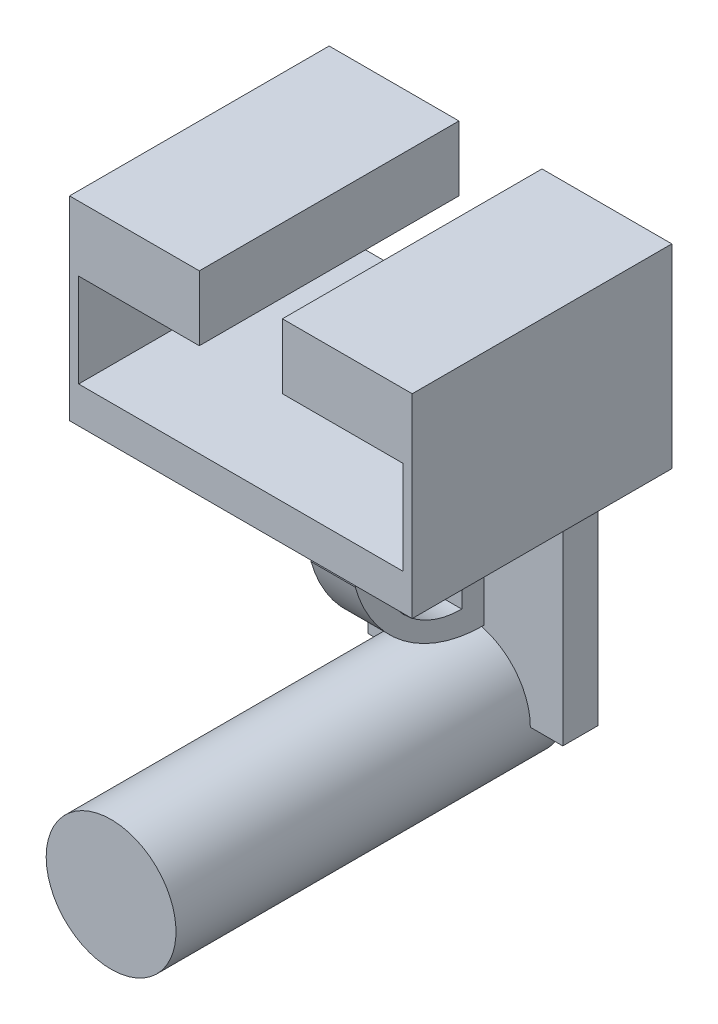
ISO-10303-21;
HEADER;
FILE_DESCRIPTION(('STEP AP214'),'2;1');
FILE_NAME('part.step','',(''),(''),'','','');
FILE_SCHEMA(('AUTOMOTIVE_DESIGN { 1 0 10303 214 1 1 1 1 }'));
ENDSEC;
DATA;
#1=APPLICATION_CONTEXT('core data for automotive mechanical design processes');
#2=APPLICATION_PROTOCOL_DEFINITION('international standard','automotive_design',2000,#1);
#3=PRODUCT_CONTEXT('',#1,'mechanical');
#4=PRODUCT('Part','Part','',(#3));
#5=PRODUCT_RELATED_PRODUCT_CATEGORY('part','',(#4));
#6=PRODUCT_DEFINITION_FORMATION('','',#4);
#7=PRODUCT_DEFINITION_CONTEXT('part definition',#1,'design');
#8=PRODUCT_DEFINITION('design','',#6,#7);
#9=PRODUCT_DEFINITION_SHAPE('','',#8);
#10=(LENGTH_UNIT() NAMED_UNIT(*) SI_UNIT(.MILLI.,.METRE.));
#11=(NAMED_UNIT(*) PLANE_ANGLE_UNIT() SI_UNIT($,.RADIAN.));
#12=(NAMED_UNIT(*) SI_UNIT($,.STERADIAN.) SOLID_ANGLE_UNIT());
#13=UNCERTAINTY_MEASURE_WITH_UNIT(LENGTH_MEASURE(1.E-05),#10,'distance_accuracy_value','');
#14=(GEOMETRIC_REPRESENTATION_CONTEXT(3) GLOBAL_UNCERTAINTY_ASSIGNED_CONTEXT((#13)) GLOBAL_UNIT_ASSIGNED_CONTEXT((#10,
#11,#12)) REPRESENTATION_CONTEXT('',''));
#15=CARTESIAN_POINT('',(0.,0.,0.));
#16=DIRECTION('',(0.,0.,1.));
#17=DIRECTION('',(1.,0.,0.));
#18=AXIS2_PLACEMENT_3D('',#15,#16,#17);
#19=CARTESIAN_POINT('',(22.6356753232579,12.7,32.004));
#20=DIRECTION('',(-1.,0.,0.));
#21=DIRECTION('',(0.,0.,1.));
#22=AXIS2_PLACEMENT_3D('',#19,#20,#21);
#23=PLANE('',#22);
#24=DIRECTION('',(0.,1.,0.));
#25=VECTOR('',#24,1.);
#26=CARTESIAN_POINT('',(22.6356753232579,47.1850733138113,27.0726006673739));
#27=LINE('',#26,#25);
#28=CARTESIAN_POINT('',(22.6356753232579,32.3983332996082,27.0726006673739));
#29=VERTEX_POINT('',#28);
#30=CARTESIAN_POINT('',(22.6356753232579,47.1850733138113,27.0726006673739));
#31=VERTEX_POINT('',#30);
#32=EDGE_CURVE('E140',#29,#31,#27,.T.);
#33=ORIENTED_EDGE('',*,*,#32,.T.);
#34=DIRECTION('',(0.,0.,-1.));
#35=VECTOR('',#34,1.);
#36=CARTESIAN_POINT('',(22.6356753232579,47.1850733138113,11.1580584486977));
#37=LINE('',#36,#35);
#38=CARTESIAN_POINT('',(22.6356753232579,47.1850733138113,11.1580584486977));
#39=VERTEX_POINT('',#38);
#40=EDGE_CURVE('E134',#31,#39,#37,.T.);
#41=ORIENTED_EDGE('',*,*,#40,.T.);
#42=DIRECTION('',(0.,-1.,0.));
#43=VECTOR('',#42,1.);
#44=CARTESIAN_POINT('',(22.6356753232579,47.1850733138113,11.1580584486977));
#45=LINE('',#44,#43);
#46=CARTESIAN_POINT('',(22.6356753232579,17.611593285405,11.1580584486977));
#47=VERTEX_POINT('',#46);
#48=EDGE_CURVE('E142',#39,#47,#45,.T.);
#49=ORIENTED_EDGE('',*,*,#48,.T.);
#50=CARTESIAN_POINT('',(22.6356753232579,33.5691449101841,11.1580584486977));
#51=DIRECTION('',(-1.,0.,0.));
#52=DIRECTION('',(0.,-1.,0.));
#53=AXIS2_PLACEMENT_3D('',#50,#51,#52);
#54=CIRCLE('',#53,15.9575516247791);
#55=EDGE_CURVE('E73',#47,#29,#54,.T.);
#56=ORIENTED_EDGE('',*,*,#55,.T.);
#57=EDGE_LOOP('',(#33,#41,#49,#56));
#58=FACE_BOUND('',#57,.T.);
#59=DIRECTION('',(0.,1.,0.));
#60=VECTOR('',#59,1.);
#61=CARTESIAN_POINT('',(22.6356753232579,12.7,32.004));
#62=LINE('',#61,#60);
#63=CARTESIAN_POINT('',(22.6356753232579,31.75,32.004));
#64=VERTEX_POINT('',#63);
#65=CARTESIAN_POINT('',(22.6356753232579,50.8,32.004));
#66=VERTEX_POINT('',#65);
#67=EDGE_CURVE('E177',#64,#66,#62,.T.);
#68=ORIENTED_EDGE('',*,*,#67,.F.);
#69=CARTESIAN_POINT('',(22.6356753232579,38.82136,6.858));
#70=DIRECTION('',(1.,0.,0.));
#71=DIRECTION('',(0.,-1.,0.));
#72=AXIS2_PLACEMENT_3D('',#69,#70,#71);
#73=CIRCLE('',#72,26.12136);
#74=CARTESIAN_POINT('',(22.6356753232579,12.7,6.858));
#75=VERTEX_POINT('',#74);
#76=EDGE_CURVE('E168',#64,#75,#73,.T.);
#77=ORIENTED_EDGE('',*,*,#76,.T.);
#78=DIRECTION('',(0.,0.,-1.));
#79=VECTOR('',#78,1.);
#80=CARTESIAN_POINT('',(22.6356753232579,12.7,32.004));
#81=LINE('',#80,#79);
#82=CARTESIAN_POINT('',(22.6356753232579,12.7,0.));
#83=VERTEX_POINT('',#82);
#84=EDGE_CURVE('E67',#75,#83,#81,.T.);
#85=ORIENTED_EDGE('',*,*,#84,.T.);
#86=DIRECTION('',(0.,1.,0.));
#87=VECTOR('',#86,1.);
#88=CARTESIAN_POINT('',(22.6356753232579,12.7,0.));
#89=LINE('',#88,#87);
#90=CARTESIAN_POINT('',(22.6356753232579,50.8,0.));
#91=VERTEX_POINT('',#90);
#92=EDGE_CURVE('E188',#83,#91,#89,.T.);
#93=ORIENTED_EDGE('',*,*,#92,.T.);
#94=DIRECTION('',(0.,0.,-1.));
#95=VECTOR('',#94,1.);
#96=CARTESIAN_POINT('',(22.6356753232579,50.8,32.004));
#97=LINE('',#96,#95);
#98=EDGE_CURVE('E193',#66,#91,#97,.T.);
#99=ORIENTED_EDGE('',*,*,#98,.F.);
#100=EDGE_LOOP('',(#68,#77,#85,#93,#99));
#101=FACE_BOUND('',#100,.T.);
#102=ADVANCED_FACE('F58',(#58,#101),#23,.F.);
#103=CARTESIAN_POINT('',(13.9824883681285,50.8,32.004));
#104=DIRECTION('',(1.,0.,0.));
#105=DIRECTION('',(0.,1.,0.));
#106=AXIS2_PLACEMENT_3D('',#103,#104,#105);
#107=PLANE('',#106);
#108=DIRECTION('',(0.,-1.,0.));
#109=VECTOR('',#108,1.);
#110=CARTESIAN_POINT('',(13.9824883681285,47.1850733138113,11.1580584486977));
#111=LINE('',#110,#109);
#112=CARTESIAN_POINT('',(13.9824883681285,47.1850733138113,11.1580584486977));
#113=VERTEX_POINT('',#112);
#114=CARTESIAN_POINT('',(13.9824883681285,17.611593285405,11.1580584486977));
#115=VERTEX_POINT('',#114);
#116=EDGE_CURVE('E157',#113,#115,#111,.T.);
#117=ORIENTED_EDGE('',*,*,#116,.F.);
#118=DIRECTION('',(0.,0.,-1.));
#119=VECTOR('',#118,1.);
#120=CARTESIAN_POINT('',(13.9824883681285,47.1850733138113,11.1580584486977));
#121=LINE('',#120,#119);
#122=CARTESIAN_POINT('',(13.9824883681285,47.1850733138113,27.0726006673739));
#123=VERTEX_POINT('',#122);
#124=EDGE_CURVE('E84',#123,#113,#121,.T.);
#125=ORIENTED_EDGE('',*,*,#124,.F.);
#126=DIRECTION('',(0.,1.,0.));
#127=VECTOR('',#126,1.);
#128=CARTESIAN_POINT('',(13.9824883681285,47.1850733138113,27.0726006673739));
#129=LINE('',#128,#127);
#130=CARTESIAN_POINT('',(13.9824883681285,32.3983332996082,27.0726006673739));
#131=VERTEX_POINT('',#130);
#132=EDGE_CURVE('E150',#131,#123,#129,.T.);
#133=ORIENTED_EDGE('',*,*,#132,.F.);
#134=CARTESIAN_POINT('',(13.9824883681285,33.5691449101841,11.1580584486977));
#135=DIRECTION('',(-1.,0.,0.));
#136=DIRECTION('',(0.,-1.,0.));
#137=AXIS2_PLACEMENT_3D('',#134,#135,#136);
#138=CIRCLE('',#137,15.9575516247791);
#139=EDGE_CURVE('E148',#115,#131,#138,.T.);
#140=ORIENTED_EDGE('',*,*,#139,.F.);
#141=EDGE_LOOP('',(#117,#125,#133,#140));
#142=FACE_BOUND('',#141,.T.);
#143=CARTESIAN_POINT('',(13.9824883681285,38.82136,6.858));
#144=DIRECTION('',(1.,0.,0.));
#145=DIRECTION('',(0.,-1.,0.));
#146=AXIS2_PLACEMENT_3D('',#143,#144,#145);
#147=CIRCLE('',#146,26.12136);
#148=CARTESIAN_POINT('',(13.9824883681285,31.75,32.004));
#149=VERTEX_POINT('',#148);
#150=CARTESIAN_POINT('',(13.9824883681285,12.7,6.858));
#151=VERTEX_POINT('',#150);
#152=EDGE_CURVE('E162',#149,#151,#147,.T.);
#153=ORIENTED_EDGE('',*,*,#152,.F.);
#154=DIRECTION('',(0.,-1.,0.));
#155=VECTOR('',#154,1.);
#156=CARTESIAN_POINT('',(13.9824883681285,50.8,32.004));
#157=LINE('',#156,#155);
#158=CARTESIAN_POINT('',(13.9824883681285,50.8,32.004));
#159=VERTEX_POINT('',#158);
#160=EDGE_CURVE('E176',#159,#149,#157,.T.);
#161=ORIENTED_EDGE('',*,*,#160,.F.);
#162=DIRECTION('',(0.,0.,-1.));
#163=VECTOR('',#162,1.);
#164=CARTESIAN_POINT('',(13.9824883681285,50.8,32.004));
#165=LINE('',#164,#163);
#166=CARTESIAN_POINT('',(13.9824883681285,50.8,0.));
#167=VERTEX_POINT('',#166);
#168=EDGE_CURVE('E183',#159,#167,#165,.T.);
#169=ORIENTED_EDGE('',*,*,#168,.T.);
#170=DIRECTION('',(0.,-1.,0.));
#171=VECTOR('',#170,1.);
#172=CARTESIAN_POINT('',(13.9824883681285,50.8,0.));
#173=LINE('',#172,#171);
#174=CARTESIAN_POINT('',(13.9824883681285,12.7,0.));
#175=VERTEX_POINT('',#174);
#176=EDGE_CURVE('E173',#167,#175,#173,.T.);
#177=ORIENTED_EDGE('',*,*,#176,.T.);
#178=DIRECTION('',(0.,0.,-1.));
#179=VECTOR('',#178,1.);
#180=CARTESIAN_POINT('',(13.9824883681285,12.7,32.004));
#181=LINE('',#180,#179);
#182=EDGE_CURVE('E12',#151,#175,#181,.T.);
#183=ORIENTED_EDGE('',*,*,#182,.F.);
#184=EDGE_LOOP('',(#153,#161,#169,#177,#183));
#185=FACE_BOUND('',#184,.T.);
#186=ADVANCED_FACE('F65',(#142,#185),#107,.F.);
#187=CARTESIAN_POINT('',(13.9824883681285,12.7,32.004));
#188=DIRECTION('',(0.,1.,0.));
#189=DIRECTION('',(0.,0.,1.));
#190=AXIS2_PLACEMENT_3D('',#187,#188,#189);
#191=PLANE('',#190);
#192=ORIENTED_EDGE('',*,*,#84,.F.);
#193=DIRECTION('',(-1.,0.,0.));
#194=VECTOR('',#193,1.);
#195=CARTESIAN_POINT('',(22.6356753232579,12.7,6.858));
#196=LINE('',#195,#194);
#197=EDGE_CURVE('E169',#75,#151,#196,.T.);
#198=ORIENTED_EDGE('',*,*,#197,.T.);
#199=ORIENTED_EDGE('',*,*,#182,.T.);
#200=DIRECTION('',(1.,0.,0.));
#201=VECTOR('',#200,1.);
#202=CARTESIAN_POINT('',(13.9824883681285,12.7,0.));
#203=LINE('',#202,#201);
#204=EDGE_CURVE('E190',#175,#83,#203,.T.);
#205=ORIENTED_EDGE('',*,*,#204,.T.);
#206=EDGE_LOOP('',(#192,#198,#199,#205));
#207=FACE_BOUND('',#206,.T.);
#208=ADVANCED_FACE('F205',(#207),#191,.F.);
#209=CARTESIAN_POINT('',(22.6356753232579,50.8,32.004));
#210=DIRECTION('',(0.,-1.,0.));
#211=DIRECTION('',(0.,0.,-1.));
#212=AXIS2_PLACEMENT_3D('',#209,#210,#211);
#213=PLANE('',#212);
#214=DIRECTION('',(-1.,0.,0.));
#215=VECTOR('',#214,1.);
#216=CARTESIAN_POINT('',(22.6356753232579,50.8,0.));
#217=LINE('',#216,#215);
#218=EDGE_CURVE('E179',#91,#167,#217,.T.);
#219=ORIENTED_EDGE('',*,*,#218,.T.);
#220=ORIENTED_EDGE('',*,*,#168,.F.);
#221=DIRECTION('',(-1.,0.,0.));
#222=VECTOR('',#221,1.);
#223=CARTESIAN_POINT('',(22.6356753232579,50.8,32.004));
#224=LINE('',#223,#222);
#225=EDGE_CURVE('E185',#66,#159,#224,.T.);
#226=ORIENTED_EDGE('',*,*,#225,.F.);
#227=ORIENTED_EDGE('',*,*,#98,.T.);
#228=EDGE_LOOP('',(#219,#220,#226,#227));
#229=FACE_BOUND('',#228,.T.);
#230=ADVANCED_FACE('F212',(#229),#213,.F.);
#231=CARTESIAN_POINT('',(0.,0.,32.004));
#232=DIRECTION('',(0.,0.,1.));
#233=DIRECTION('',(1.,0.,0.));
#234=AXIS2_PLACEMENT_3D('',#231,#232,#233);
#235=PLANE('',#234);
#236=DIRECTION('',(-1.,0.,0.));
#237=VECTOR('',#236,1.);
#238=CARTESIAN_POINT('',(22.6356753232579,31.75,32.004));
#239=LINE('',#238,#237);
#240=EDGE_CURVE('E171',#64,#149,#239,.T.);
#241=ORIENTED_EDGE('',*,*,#240,.F.);
#242=ORIENTED_EDGE('',*,*,#67,.T.);
#243=ORIENTED_EDGE('',*,*,#225,.T.);
#244=ORIENTED_EDGE('',*,*,#160,.T.);
#245=EDGE_LOOP('',(#241,#242,#243,#244));
#246=FACE_BOUND('',#245,.T.);
#247=ADVANCED_FACE('F217',(#246),#235,.T.);
#248=CARTESIAN_POINT('',(0.,0.,0.));
#249=DIRECTION('',(0.,0.,1.));
#250=DIRECTION('',(1.,0.,0.));
#251=AXIS2_PLACEMENT_3D('',#248,#249,#250);
#252=PLANE('',#251);
#253=ORIENTED_EDGE('',*,*,#176,.F.);
#254=ORIENTED_EDGE('',*,*,#218,.F.);
#255=ORIENTED_EDGE('',*,*,#92,.F.);
#256=ORIENTED_EDGE('',*,*,#204,.F.);
#257=EDGE_LOOP('',(#253,#254,#255,#256));
#258=FACE_BOUND('',#257,.T.);
#259=ADVANCED_FACE('F206',(#258),#252,.F.);
#260=CARTESIAN_POINT('',(22.6356753232579,38.82136,6.858));
#261=DIRECTION('',(-1.,0.,0.));
#262=DIRECTION('',(0.,-1.,0.));
#263=AXIS2_PLACEMENT_3D('',#260,#261,#262);
#264=CYLINDRICAL_SURFACE('',#263,26.12136);
#265=ORIENTED_EDGE('',*,*,#152,.T.);
#266=ORIENTED_EDGE('',*,*,#197,.F.);
#267=ORIENTED_EDGE('',*,*,#76,.F.);
#268=ORIENTED_EDGE('',*,*,#240,.T.);
#269=EDGE_LOOP('',(#265,#266,#267,#268));
#270=FACE_BOUND('',#269,.T.);
#271=ADVANCED_FACE('F216',(#270),#264,.T.);
#272=CARTESIAN_POINT('',(22.6356753232579,47.1850733138113,11.1580584486977));
#273=DIRECTION('',(0.,1.,0.));
#274=DIRECTION('',(-1.,0.,0.));
#275=AXIS2_PLACEMENT_3D('',#272,#273,#274);
#276=PLANE('',#275);
#277=ORIENTED_EDGE('',*,*,#124,.T.);
#278=DIRECTION('',(-1.,0.,0.));
#279=VECTOR('',#278,1.);
#280=CARTESIAN_POINT('',(22.6356753232579,47.1850733138113,11.1580584486977));
#281=LINE('',#280,#279);
#282=EDGE_CURVE('E129',#39,#113,#281,.T.);
#283=ORIENTED_EDGE('',*,*,#282,.F.);
#284=ORIENTED_EDGE('',*,*,#40,.F.);
#285=DIRECTION('',(-1.,0.,0.));
#286=VECTOR('',#285,1.);
#287=CARTESIAN_POINT('',(22.6356753232579,47.1850733138113,27.0726006673739));
#288=LINE('',#287,#286);
#289=EDGE_CURVE('E158',#31,#123,#288,.T.);
#290=ORIENTED_EDGE('',*,*,#289,.T.);
#291=EDGE_LOOP('',(#277,#283,#284,#290));
#292=FACE_BOUND('',#291,.T.);
#293=ADVANCED_FACE('F128',(#292),#276,.F.);
#294=CARTESIAN_POINT('',(22.6356753232579,47.1850733138113,27.0726006673739));
#295=DIRECTION('',(0.,0.,1.));
#296=DIRECTION('',(1.,0.,0.));
#297=AXIS2_PLACEMENT_3D('',#294,#295,#296);
#298=PLANE('',#297);
#299=ORIENTED_EDGE('',*,*,#132,.T.);
#300=ORIENTED_EDGE('',*,*,#289,.F.);
#301=ORIENTED_EDGE('',*,*,#32,.F.);
#302=DIRECTION('',(-1.,0.,0.));
#303=VECTOR('',#302,1.);
#304=CARTESIAN_POINT('',(22.6356753232579,32.3983332996082,27.0726006673739));
#305=LINE('',#304,#303);
#306=EDGE_CURVE('E161',#29,#131,#305,.T.);
#307=ORIENTED_EDGE('',*,*,#306,.T.);
#308=EDGE_LOOP('',(#299,#300,#301,#307));
#309=FACE_BOUND('',#308,.T.);
#310=ADVANCED_FACE('F228',(#309),#298,.F.);
#311=CARTESIAN_POINT('',(22.6356753232579,33.5691449101841,11.1580584486977));
#312=DIRECTION('',(-1.,0.,0.));
#313=DIRECTION('',(0.,-1.,0.));
#314=AXIS2_PLACEMENT_3D('',#311,#312,#313);
#315=CYLINDRICAL_SURFACE('',#314,15.9575516247791);
#316=ORIENTED_EDGE('',*,*,#139,.T.);
#317=ORIENTED_EDGE('',*,*,#306,.F.);
#318=ORIENTED_EDGE('',*,*,#55,.F.);
#319=DIRECTION('',(-1.,0.,0.));
#320=VECTOR('',#319,1.);
#321=CARTESIAN_POINT('',(22.6356753232579,17.611593285405,11.1580584486977));
#322=LINE('',#321,#320);
#323=EDGE_CURVE('E139',#47,#115,#322,.T.);
#324=ORIENTED_EDGE('',*,*,#323,.T.);
#325=EDGE_LOOP('',(#316,#317,#318,#324));
#326=FACE_BOUND('',#325,.T.);
#327=ADVANCED_FACE('F275',(#326),#315,.F.);
#328=CARTESIAN_POINT('',(22.6356753232579,47.1850733138113,11.1580584486977));
#329=DIRECTION('',(0.,0.,-1.));
#330=DIRECTION('',(-1.,0.,0.));
#331=AXIS2_PLACEMENT_3D('',#328,#329,#330);
#332=PLANE('',#331);
#333=ORIENTED_EDGE('',*,*,#116,.T.);
#334=ORIENTED_EDGE('',*,*,#323,.F.);
#335=ORIENTED_EDGE('',*,*,#48,.F.);
#336=ORIENTED_EDGE('',*,*,#282,.T.);
#337=EDGE_LOOP('',(#333,#334,#335,#336));
#338=FACE_BOUND('',#337,.T.);
#339=ADVANCED_FACE('F145',(#338),#332,.F.);
#340=CLOSED_SHELL('',(#102,#186,#208,#230,#247,#259,#271,#293,#310,#327,#339));
#341=MANIFOLD_SOLID_BREP('B2',#340);
#342=CARTESIAN_POINT('',(-12.7,0.,0.));
#343=DIRECTION('',(-1.,0.,0.));
#344=DIRECTION('',(0.,0.,1.));
#345=AXIS2_PLACEMENT_3D('',#342,#343,#344);
#346=PLANE('',#345);
#347=DIRECTION('',(0.,0.,-1.));
#348=VECTOR('',#347,1.);
#349=CARTESIAN_POINT('',(-12.7,76.2,0.));
#350=LINE('',#349,#348);
#351=CARTESIAN_POINT('',(-12.7,76.2,50.8));
#352=VERTEX_POINT('',#351);
#353=CARTESIAN_POINT('',(-12.7,76.2,0.));
#354=VERTEX_POINT('',#353);
#355=EDGE_CURVE('E59',#352,#354,#350,.T.);
#356=ORIENTED_EDGE('',*,*,#355,.F.);
#357=DIRECTION('',(0.,1.,0.));
#358=VECTOR('',#357,1.);
#359=CARTESIAN_POINT('',(-12.7,88.9,50.8));
#360=LINE('',#359,#358);
#361=CARTESIAN_POINT('',(-12.7,57.912,50.8));
#362=VERTEX_POINT('',#361);
#363=EDGE_CURVE('E455',#362,#352,#360,.T.);
#364=ORIENTED_EDGE('',*,*,#363,.F.);
#365=DIRECTION('',(0.,0.,1.));
#366=VECTOR('',#365,1.);
#367=CARTESIAN_POINT('',(-12.7,57.912,0.));
#368=LINE('',#367,#366);
#369=CARTESIAN_POINT('',(-12.7,57.912,0.));
#370=VERTEX_POINT('',#369);
#371=EDGE_CURVE('E555',#370,#362,#368,.T.);
#372=ORIENTED_EDGE('',*,*,#371,.F.);
#373=DIRECTION('',(0.,-1.,0.));
#374=VECTOR('',#373,1.);
#375=CARTESIAN_POINT('',(-12.7,88.9,0.));
#376=LINE('',#375,#374);
#377=EDGE_CURVE('E499',#354,#370,#376,.T.);
#378=ORIENTED_EDGE('',*,*,#377,.F.);
#379=EDGE_LOOP('',(#356,#364,#372,#378));
#380=FACE_BOUND('',#379,.T.);
#381=ADVANCED_FACE('F322',(#380),#346,.F.);
#382=CARTESIAN_POINT('',(0.,0.,6.858));
#383=DIRECTION('',(0.,1.,0.));
#384=DIRECTION('',(0.,0.,1.));
#385=AXIS2_PLACEMENT_3D('',#382,#383,#384);
#386=PLANE('',#385);
#387=DIRECTION('',(1.,0.,0.));
#388=VECTOR('',#387,1.);
#389=CARTESIAN_POINT('',(0.,0.,0.));
#390=LINE('',#389,#388);
#391=CARTESIAN_POINT('',(0.,0.,0.));
#392=VERTEX_POINT('',#391);
#393=CARTESIAN_POINT('',(6.35000000000003,0.,0.));
#394=VERTEX_POINT('',#393);
#395=EDGE_CURVE('E584',#392,#394,#390,.T.);
#396=ORIENTED_EDGE('',*,*,#395,.T.);
#397=DIRECTION('',(0.,0.,-1.));
#398=VECTOR('',#397,1.);
#399=CARTESIAN_POINT('',(6.34999999999999,0.,6.858));
#400=LINE('',#399,#398);
#401=CARTESIAN_POINT('',(6.35000000000003,0.,6.858));
#402=VERTEX_POINT('',#401);
#403=EDGE_CURVE('E639',#402,#394,#400,.T.);
#404=ORIENTED_EDGE('',*,*,#403,.F.);
#405=DIRECTION('',(1.,0.,0.));
#406=VECTOR('',#405,1.);
#407=CARTESIAN_POINT('',(0.,0.,6.858));
#408=LINE('',#407,#406);
#409=CARTESIAN_POINT('',(0.,0.,6.858));
#410=VERTEX_POINT('',#409);
#411=EDGE_CURVE('E589',#410,#402,#408,.T.);
#412=ORIENTED_EDGE('',*,*,#411,.F.);
#413=DIRECTION('',(0.,0.,-1.));
#414=VECTOR('',#413,1.);
#415=CARTESIAN_POINT('',(0.,0.,6.858));
#416=LINE('',#415,#414);
#417=EDGE_CURVE('E606',#410,#392,#416,.T.);
#418=ORIENTED_EDGE('',*,*,#417,.T.);
#419=EDGE_LOOP('',(#396,#404,#412,#418));
#420=FACE_BOUND('',#419,.T.);
#421=ADVANCED_FACE('F324',(#420),#386,.F.);
#422=CARTESIAN_POINT('',(31.75,0.,6.858));
#423=DIRECTION('',(0.,1.,0.));
#424=DIRECTION('',(0.,0.,1.));
#425=AXIS2_PLACEMENT_3D('',#422,#423,#424);
#426=PLANE('',#425);
#427=DIRECTION('',(1.,0.,0.));
#428=VECTOR('',#427,1.);
#429=CARTESIAN_POINT('',(31.75,0.,0.));
#430=LINE('',#429,#428);
#431=CARTESIAN_POINT('',(31.75,0.,0.));
#432=VERTEX_POINT('',#431);
#433=CARTESIAN_POINT('',(38.1,0.,0.));
#434=VERTEX_POINT('',#433);
#435=EDGE_CURVE('E611',#432,#434,#430,.T.);
#436=ORIENTED_EDGE('',*,*,#435,.T.);
#437=DIRECTION('',(0.,0.,-1.));
#438=VECTOR('',#437,1.);
#439=CARTESIAN_POINT('',(38.1,0.,6.858));
#440=LINE('',#439,#438);
#441=CARTESIAN_POINT('',(38.1,0.,6.858));
#442=VERTEX_POINT('',#441);
#443=EDGE_CURVE('E635',#442,#434,#440,.T.);
#444=ORIENTED_EDGE('',*,*,#443,.F.);
#445=DIRECTION('',(1.,0.,0.));
#446=VECTOR('',#445,1.);
#447=CARTESIAN_POINT('',(31.75,0.,6.858));
#448=LINE('',#447,#446);
#449=CARTESIAN_POINT('',(31.75,0.,6.858));
#450=VERTEX_POINT('',#449);
#451=EDGE_CURVE('E597',#450,#442,#448,.T.);
#452=ORIENTED_EDGE('',*,*,#451,.F.);
#453=DIRECTION('',(0.,0.,-1.));
#454=VECTOR('',#453,1.);
#455=CARTESIAN_POINT('',(31.75,0.,6.858));
#456=LINE('',#455,#454);
#457=EDGE_CURVE('E636',#450,#432,#456,.T.);
#458=ORIENTED_EDGE('',*,*,#457,.T.);
#459=EDGE_LOOP('',(#436,#444,#452,#458));
#460=FACE_BOUND('',#459,.T.);
#461=ADVANCED_FACE('F681',(#460),#426,.F.);
#462=CARTESIAN_POINT('',(38.1,0.,6.858));
#463=DIRECTION('',(-1.,0.,0.));
#464=DIRECTION('',(0.,0.,1.));
#465=AXIS2_PLACEMENT_3D('',#462,#463,#464);
#466=PLANE('',#465);
#467=DIRECTION('',(0.,1.,0.));
#468=VECTOR('',#467,1.);
#469=CARTESIAN_POINT('',(38.1,0.,0.));
#470=LINE('',#469,#468);
#471=CARTESIAN_POINT('',(38.1,50.8,0.));
#472=VERTEX_POINT('',#471);
#473=EDGE_CURVE('E617',#434,#472,#470,.T.);
#474=ORIENTED_EDGE('',*,*,#473,.T.);
#475=DIRECTION('',(0.,0.,-1.));
#476=VECTOR('',#475,1.);
#477=CARTESIAN_POINT('',(38.1,50.8,6.858));
#478=LINE('',#477,#476);
#479=CARTESIAN_POINT('',(38.1,50.8,6.858));
#480=VERTEX_POINT('',#479);
#481=EDGE_CURVE('E628',#480,#472,#478,.T.);
#482=ORIENTED_EDGE('',*,*,#481,.F.);
#483=DIRECTION('',(0.,1.,0.));
#484=VECTOR('',#483,1.);
#485=CARTESIAN_POINT('',(38.1,0.,6.858));
#486=LINE('',#485,#484);
#487=EDGE_CURVE('E599',#442,#480,#486,.T.);
#488=ORIENTED_EDGE('',*,*,#487,.F.);
#489=ORIENTED_EDGE('',*,*,#443,.T.);
#490=EDGE_LOOP('',(#474,#482,#488,#489));
#491=FACE_BOUND('',#490,.T.);
#492=ADVANCED_FACE('F680',(#491),#466,.F.);
#493=CARTESIAN_POINT('',(0.,0.,6.858));
#494=DIRECTION('',(-1.,0.,0.));
#495=DIRECTION('',(0.,0.,1.));
#496=AXIS2_PLACEMENT_3D('',#493,#494,#495);
#497=PLANE('',#496);
#498=DIRECTION('',(0.,1.,0.));
#499=VECTOR('',#498,1.);
#500=CARTESIAN_POINT('',(0.,0.,0.));
#501=LINE('',#500,#499);
#502=CARTESIAN_POINT('',(0.,50.8,0.));
#503=VERTEX_POINT('',#502);
#504=EDGE_CURVE('E594',#392,#503,#501,.T.);
#505=ORIENTED_EDGE('',*,*,#504,.F.);
#506=ORIENTED_EDGE('',*,*,#417,.F.);
#507=DIRECTION('',(0.,1.,0.));
#508=VECTOR('',#507,1.);
#509=CARTESIAN_POINT('',(0.,0.,6.858));
#510=LINE('',#509,#508);
#511=CARTESIAN_POINT('',(0.,50.8,6.858));
#512=VERTEX_POINT('',#511);
#513=EDGE_CURVE('E608',#410,#512,#510,.T.);
#514=ORIENTED_EDGE('',*,*,#513,.T.);
#515=DIRECTION('',(0.,0.,-1.));
#516=VECTOR('',#515,1.);
#517=CARTESIAN_POINT('',(0.,50.8,6.858));
#518=LINE('',#517,#516);
#519=EDGE_CURVE('E622',#512,#503,#518,.T.);
#520=ORIENTED_EDGE('',*,*,#519,.T.);
#521=EDGE_LOOP('',(#505,#506,#514,#520));
#522=FACE_BOUND('',#521,.T.);
#523=ADVANCED_FACE('F696',(#522),#497,.T.);
#524=CARTESIAN_POINT('',(19.05,0.,6.858));
#525=DIRECTION('',(0.,0.,-1.));
#526=DIRECTION('',(-1.,0.,0.));
#527=AXIS2_PLACEMENT_3D('',#524,#525,#526);
#528=PLANE('',#527);
#529=ORIENTED_EDGE('',*,*,#411,.T.);
#530=CARTESIAN_POINT('',(19.05,0.,6.858));
#531=DIRECTION('',(0.,0.,-1.));
#532=DIRECTION('',(-1.,0.,0.));
#533=AXIS2_PLACEMENT_3D('',#530,#531,#532);
#534=CIRCLE('',#533,12.7);
#535=EDGE_CURVE('E592',#402,#450,#534,.T.);
#536=ORIENTED_EDGE('',*,*,#535,.T.);
#537=ORIENTED_EDGE('',*,*,#451,.T.);
#538=ORIENTED_EDGE('',*,*,#487,.T.);
#539=DIRECTION('',(1.,0.,0.));
#540=VECTOR('',#539,1.);
#541=CARTESIAN_POINT('',(0.,50.8,6.858));
#542=LINE('',#541,#540);
#543=EDGE_CURVE('E605',#512,#480,#542,.T.);
#544=ORIENTED_EDGE('',*,*,#543,.F.);
#545=ORIENTED_EDGE('',*,*,#513,.F.);
#546=EDGE_LOOP('',(#529,#536,#537,#538,#544,#545));
#547=FACE_BOUND('',#546,.T.);
#548=ADVANCED_FACE('F690',(#547),#528,.F.);
#549=CARTESIAN_POINT('',(19.05,0.,0.));
#550=DIRECTION('',(0.,0.,-1.));
#551=DIRECTION('',(-1.,0.,0.));
#552=AXIS2_PLACEMENT_3D('',#549,#550,#551);
#553=PLANE('',#552);
#554=DIRECTION('',(-1.,0.,0.));
#555=VECTOR('',#554,1.);
#556=CARTESIAN_POINT('',(-12.7,50.8,0.));
#557=LINE('',#556,#555);
#558=CARTESIAN_POINT('',(-14.478,50.8,0.));
#559=VERTEX_POINT('',#558);
#560=EDGE_CURVE('E574',#503,#559,#557,.T.);
#561=ORIENTED_EDGE('',*,*,#560,.T.);
#562=DIRECTION('',(0.,-1.,0.));
#563=VECTOR('',#562,1.);
#564=CARTESIAN_POINT('',(-14.478,88.9,0.));
#565=LINE('',#564,#563);
#566=CARTESIAN_POINT('',(-14.478,88.9,0.));
#567=VERTEX_POINT('',#566);
#568=EDGE_CURVE('E502',#567,#559,#565,.T.);
#569=ORIENTED_EDGE('',*,*,#568,.F.);
#570=DIRECTION('',(1.,0.,0.));
#571=VECTOR('',#570,1.);
#572=CARTESIAN_POINT('',(-14.478,88.9,0.));
#573=LINE('',#572,#571);
#574=CARTESIAN_POINT('',(10.922,88.9,0.));
#575=VERTEX_POINT('',#574);
#576=EDGE_CURVE('E520',#567,#575,#573,.T.);
#577=ORIENTED_EDGE('',*,*,#576,.T.);
#578=DIRECTION('',(0.,1.,0.));
#579=VECTOR('',#578,1.);
#580=CARTESIAN_POINT('',(10.922,76.2,0.));
#581=LINE('',#580,#579);
#582=CARTESIAN_POINT('',(10.922,76.2,0.));
#583=VERTEX_POINT('',#582);
#584=EDGE_CURVE('E467',#583,#575,#581,.T.);
#585=ORIENTED_EDGE('',*,*,#584,.F.);
#586=DIRECTION('',(-1.,0.,0.));
#587=VECTOR('',#586,1.);
#588=CARTESIAN_POINT('',(-14.478,76.2,0.));
#589=LINE('',#588,#587);
#590=EDGE_CURVE('E470',#583,#354,#589,.T.);
#591=ORIENTED_EDGE('',*,*,#590,.T.);
#592=ORIENTED_EDGE('',*,*,#377,.T.);
#593=DIRECTION('',(-1.,0.,0.));
#594=VECTOR('',#593,1.);
#595=CARTESIAN_POINT('',(-12.7,57.912,0.));
#596=LINE('',#595,#594);
#597=CARTESIAN_POINT('',(50.8,57.912,0.));
#598=VERTEX_POINT('',#597);
#599=EDGE_CURVE('E570',#598,#370,#596,.T.);
#600=ORIENTED_EDGE('',*,*,#599,.F.);
#601=DIRECTION('',(0.,1.,0.));
#602=VECTOR('',#601,1.);
#603=CARTESIAN_POINT('',(50.8,88.9,0.));
#604=LINE('',#603,#602);
#605=CARTESIAN_POINT('',(50.8,76.2,0.));
#606=VERTEX_POINT('',#605);
#607=EDGE_CURVE('E535',#598,#606,#604,.T.);
#608=ORIENTED_EDGE('',*,*,#607,.T.);
#609=DIRECTION('',(-1.,0.,0.));
#610=VECTOR('',#609,1.);
#611=CARTESIAN_POINT('',(52.578,76.2,0.));
#612=LINE('',#611,#610);
#613=CARTESIAN_POINT('',(27.178,76.2,0.));
#614=VERTEX_POINT('',#613);
#615=EDGE_CURVE('E344',#606,#614,#612,.T.);
#616=ORIENTED_EDGE('',*,*,#615,.T.);
#617=DIRECTION('',(0.,1.,0.));
#618=VECTOR('',#617,1.);
#619=CARTESIAN_POINT('',(27.178,76.2,0.));
#620=LINE('',#619,#618);
#621=CARTESIAN_POINT('',(27.178,88.9,0.));
#622=VERTEX_POINT('',#621);
#623=EDGE_CURVE('E495',#614,#622,#620,.T.);
#624=ORIENTED_EDGE('',*,*,#623,.T.);
#625=DIRECTION('',(-1.,0.,0.));
#626=VECTOR('',#625,1.);
#627=CARTESIAN_POINT('',(52.578,88.9,0.));
#628=LINE('',#627,#626);
#629=CARTESIAN_POINT('',(52.578,88.9,0.));
#630=VERTEX_POINT('',#629);
#631=EDGE_CURVE('E548',#630,#622,#628,.T.);
#632=ORIENTED_EDGE('',*,*,#631,.F.);
#633=DIRECTION('',(0.,1.,0.));
#634=VECTOR('',#633,1.);
#635=CARTESIAN_POINT('',(52.578,88.9,0.));
#636=LINE('',#635,#634);
#637=CARTESIAN_POINT('',(52.578,50.8,0.));
#638=VERTEX_POINT('',#637);
#639=EDGE_CURVE('E537',#638,#630,#636,.T.);
#640=ORIENTED_EDGE('',*,*,#639,.F.);
#641=EDGE_CURVE('E559',#638,#472,#557,.T.);
#642=ORIENTED_EDGE('',*,*,#641,.T.);
#643=ORIENTED_EDGE('',*,*,#473,.F.);
#644=ORIENTED_EDGE('',*,*,#435,.F.);
#645=CARTESIAN_POINT('',(19.05,0.,0.));
#646=DIRECTION('',(0.,0.,-1.));
#647=DIRECTION('',(-1.,0.,0.));
#648=AXIS2_PLACEMENT_3D('',#645,#646,#647);
#649=CIRCLE('',#648,12.7);
#650=EDGE_CURVE('E571',#432,#394,#649,.T.);
#651=ORIENTED_EDGE('',*,*,#650,.T.);
#652=ORIENTED_EDGE('',*,*,#395,.F.);
#653=ORIENTED_EDGE('',*,*,#504,.T.);
#654=EDGE_LOOP('',(#561,#569,#577,#585,#591,#592,#600,#608,#616,#624,#632,#640,#642,#643,#644,
#651,#652,#653));
#655=FACE_BOUND('',#654,.T.);
#656=ADVANCED_FACE('F653',(#655),#553,.T.);
#657=CARTESIAN_POINT('',(19.05,0.,76.2));
#658=DIRECTION('',(0.,0.,-1.));
#659=DIRECTION('',(-1.,0.,0.));
#660=AXIS2_PLACEMENT_3D('',#657,#658,#659);
#661=CYLINDRICAL_SURFACE('',#660,12.7);
#662=CARTESIAN_POINT('',(19.05,0.,76.2));
#663=DIRECTION('',(0.,0.,-1.));
#664=DIRECTION('',(-1.,0.,0.));
#665=AXIS2_PLACEMENT_3D('',#662,#663,#664);
#666=CIRCLE('',#665,12.7);
#667=CARTESIAN_POINT('',(6.35000000000003,0.,76.2));
#668=VERTEX_POINT('',#667);
#669=EDGE_CURVE('E576',#668,#668,#666,.T.);
#670=ORIENTED_EDGE('',*,*,#669,.T.);
#671=EDGE_LOOP('',(#670));
#672=FACE_BOUND('',#671,.T.);
#673=ORIENTED_EDGE('',*,*,#457,.F.);
#674=ORIENTED_EDGE('',*,*,#535,.F.);
#675=ORIENTED_EDGE('',*,*,#403,.T.);
#676=ORIENTED_EDGE('',*,*,#650,.F.);
#677=EDGE_LOOP('',(#673,#674,#675,#676));
#678=FACE_BOUND('',#677,.T.);
#679=ADVANCED_FACE('F684',(#672,#678),#661,.T.);
#680=CARTESIAN_POINT('',(19.05,0.,76.2));
#681=DIRECTION('',(0.,0.,-1.));
#682=DIRECTION('',(-1.,0.,0.));
#683=AXIS2_PLACEMENT_3D('',#680,#681,#682);
#684=PLANE('',#683);
#685=ORIENTED_EDGE('',*,*,#669,.F.);
#686=EDGE_LOOP('',(#685));
#687=FACE_BOUND('',#686,.T.);
#688=ADVANCED_FACE('F745',(#687),#684,.F.);
#689=CARTESIAN_POINT('',(-12.7,57.912,50.8));
#690=DIRECTION('',(0.,0.,-1.));
#691=DIRECTION('',(-1.,0.,0.));
#692=AXIS2_PLACEMENT_3D('',#689,#690,#691);
#693=PLANE('',#692);
#694=DIRECTION('',(1.,0.,0.));
#695=VECTOR('',#694,1.);
#696=CARTESIAN_POINT('',(-14.478,88.9,50.8));
#697=LINE('',#696,#695);
#698=CARTESIAN_POINT('',(-14.478,88.9,50.8));
#699=VERTEX_POINT('',#698);
#700=CARTESIAN_POINT('',(10.922,88.9,50.8));
#701=VERTEX_POINT('',#700);
#702=EDGE_CURVE('E525',#699,#701,#697,.T.);
#703=ORIENTED_EDGE('',*,*,#702,.F.);
#704=DIRECTION('',(0.,1.,0.));
#705=VECTOR('',#704,1.);
#706=CARTESIAN_POINT('',(-14.478,88.9,50.8));
#707=LINE('',#706,#705);
#708=CARTESIAN_POINT('',(-14.478,50.8,50.8));
#709=VERTEX_POINT('',#708);
#710=EDGE_CURVE('E512',#709,#699,#707,.T.);
#711=ORIENTED_EDGE('',*,*,#710,.F.);
#712=DIRECTION('',(1.,0.,0.));
#713=VECTOR('',#712,1.);
#714=CARTESIAN_POINT('',(-12.7,50.8,50.8));
#715=LINE('',#714,#713);
#716=CARTESIAN_POINT('',(52.578,50.8,50.8));
#717=VERTEX_POINT('',#716);
#718=EDGE_CURVE('E551',#709,#717,#715,.T.);
#719=ORIENTED_EDGE('',*,*,#718,.T.);
#720=DIRECTION('',(0.,-1.,0.));
#721=VECTOR('',#720,1.);
#722=CARTESIAN_POINT('',(52.578,88.9,50.8));
#723=LINE('',#722,#721);
#724=CARTESIAN_POINT('',(52.578,88.9,50.8));
#725=VERTEX_POINT('',#724);
#726=EDGE_CURVE('E530',#725,#717,#723,.T.);
#727=ORIENTED_EDGE('',*,*,#726,.F.);
#728=DIRECTION('',(-1.,0.,0.));
#729=VECTOR('',#728,1.);
#730=CARTESIAN_POINT('',(52.578,88.9,50.8));
#731=LINE('',#730,#729);
#732=CARTESIAN_POINT('',(27.178,88.9,50.8));
#733=VERTEX_POINT('',#732);
#734=EDGE_CURVE('E544',#725,#733,#731,.T.);
#735=ORIENTED_EDGE('',*,*,#734,.T.);
#736=DIRECTION('',(0.,1.,0.));
#737=VECTOR('',#736,1.);
#738=CARTESIAN_POINT('',(27.178,76.2,50.8));
#739=LINE('',#738,#737);
#740=CARTESIAN_POINT('',(27.178,76.2,50.8));
#741=VERTEX_POINT('',#740);
#742=EDGE_CURVE('E496',#741,#733,#739,.T.);
#743=ORIENTED_EDGE('',*,*,#742,.F.);
#744=DIRECTION('',(1.,0.,0.));
#745=VECTOR('',#744,1.);
#746=CARTESIAN_POINT('',(52.578,76.2,50.8));
#747=LINE('',#746,#745);
#748=CARTESIAN_POINT('',(50.8,76.2,50.8));
#749=VERTEX_POINT('',#748);
#750=EDGE_CURVE('E486',#741,#749,#747,.T.);
#751=ORIENTED_EDGE('',*,*,#750,.T.);
#752=DIRECTION('',(0.,-1.,0.));
#753=VECTOR('',#752,1.);
#754=CARTESIAN_POINT('',(50.8,88.9,50.8));
#755=LINE('',#754,#753);
#756=CARTESIAN_POINT('',(50.8,57.912,50.8));
#757=VERTEX_POINT('',#756);
#758=EDGE_CURVE('E529',#749,#757,#755,.T.);
#759=ORIENTED_EDGE('',*,*,#758,.T.);
#760=DIRECTION('',(1.,0.,0.));
#761=VECTOR('',#760,1.);
#762=CARTESIAN_POINT('',(-12.7,57.912,50.8));
#763=LINE('',#762,#761);
#764=EDGE_CURVE('E556',#362,#757,#763,.T.);
#765=ORIENTED_EDGE('',*,*,#764,.F.);
#766=ORIENTED_EDGE('',*,*,#363,.T.);
#767=DIRECTION('',(1.,0.,0.));
#768=VECTOR('',#767,1.);
#769=CARTESIAN_POINT('',(-14.478,76.2,50.8));
#770=LINE('',#769,#768);
#771=CARTESIAN_POINT('',(10.922,76.2,50.8));
#772=VERTEX_POINT('',#771);
#773=EDGE_CURVE('E444',#352,#772,#770,.T.);
#774=ORIENTED_EDGE('',*,*,#773,.T.);
#775=DIRECTION('',(0.,1.,0.));
#776=VECTOR('',#775,1.);
#777=CARTESIAN_POINT('',(10.922,76.2,50.8));
#778=LINE('',#777,#776);
#779=EDGE_CURVE('E446',#772,#701,#778,.T.);
#780=ORIENTED_EDGE('',*,*,#779,.T.);
#781=EDGE_LOOP('',(#703,#711,#719,#727,#735,#743,#751,#759,#765,#766,#774,#780));
#782=FACE_BOUND('',#781,.T.);
#783=ADVANCED_FACE('F449',(#782),#693,.F.);
#784=CARTESIAN_POINT('',(0.,57.912,0.));
#785=DIRECTION('',(0.,1.,0.));
#786=DIRECTION('',(0.,0.,1.));
#787=AXIS2_PLACEMENT_3D('',#784,#785,#786);
#788=PLANE('',#787);
#789=ORIENTED_EDGE('',*,*,#371,.T.);
#790=ORIENTED_EDGE('',*,*,#764,.T.);
#791=DIRECTION('',(0.,0.,-1.));
#792=VECTOR('',#791,1.);
#793=CARTESIAN_POINT('',(50.8,57.912,0.));
#794=LINE('',#793,#792);
#795=EDGE_CURVE('E563',#757,#598,#794,.T.);
#796=ORIENTED_EDGE('',*,*,#795,.T.);
#797=ORIENTED_EDGE('',*,*,#599,.T.);
#798=EDGE_LOOP('',(#789,#790,#796,#797));
#799=FACE_BOUND('',#798,.T.);
#800=ADVANCED_FACE('F651',(#799),#788,.T.);
#801=CARTESIAN_POINT('',(0.,50.8,0.));
#802=DIRECTION('',(0.,1.,0.));
#803=DIRECTION('',(0.,0.,1.));
#804=AXIS2_PLACEMENT_3D('',#801,#802,#803);
#805=PLANE('',#804);
#806=ORIENTED_EDGE('',*,*,#519,.F.);
#807=ORIENTED_EDGE('',*,*,#543,.T.);
#808=ORIENTED_EDGE('',*,*,#481,.T.);
#809=ORIENTED_EDGE('',*,*,#641,.F.);
#810=DIRECTION('',(0.,0.,-1.));
#811=VECTOR('',#810,1.);
#812=CARTESIAN_POINT('',(52.578,50.8,50.8));
#813=LINE('',#812,#811);
#814=EDGE_CURVE('E532',#717,#638,#813,.T.);
#815=ORIENTED_EDGE('',*,*,#814,.F.);
#816=ORIENTED_EDGE('',*,*,#718,.F.);
#817=DIRECTION('',(0.,0.,1.));
#818=VECTOR('',#817,1.);
#819=CARTESIAN_POINT('',(-14.478,50.8,0.));
#820=LINE('',#819,#818);
#821=EDGE_CURVE('E510',#559,#709,#820,.T.);
#822=ORIENTED_EDGE('',*,*,#821,.F.);
#823=ORIENTED_EDGE('',*,*,#560,.F.);
#824=EDGE_LOOP('',(#806,#807,#808,#809,#815,#816,#822,#823));
#825=FACE_BOUND('',#824,.T.);
#826=ADVANCED_FACE('F674',(#825),#805,.F.);
#827=CARTESIAN_POINT('',(52.578,88.9,50.8));
#828=DIRECTION('',(0.,-1.,0.));
#829=DIRECTION('',(0.,0.,-1.));
#830=AXIS2_PLACEMENT_3D('',#827,#828,#829);
#831=PLANE('',#830);
#832=ORIENTED_EDGE('',*,*,#631,.T.);
#833=DIRECTION('',(0.,0.,1.));
#834=VECTOR('',#833,1.);
#835=CARTESIAN_POINT('',(27.178,88.9,0.));
#836=LINE('',#835,#834);
#837=EDGE_CURVE('E476',#622,#733,#836,.T.);
#838=ORIENTED_EDGE('',*,*,#837,.T.);
#839=ORIENTED_EDGE('',*,*,#734,.F.);
#840=DIRECTION('',(0.,0.,1.));
#841=VECTOR('',#840,1.);
#842=CARTESIAN_POINT('',(52.578,88.9,50.8));
#843=LINE('',#842,#841);
#844=EDGE_CURVE('E536',#630,#725,#843,.T.);
#845=ORIENTED_EDGE('',*,*,#844,.F.);
#846=EDGE_LOOP('',(#832,#838,#839,#845));
#847=FACE_BOUND('',#846,.T.);
#848=ADVANCED_FACE('F663',(#847),#831,.F.);
#849=CARTESIAN_POINT('',(52.578,0.,0.));
#850=DIRECTION('',(1.,0.,0.));
#851=DIRECTION('',(0.,0.,-1.));
#852=AXIS2_PLACEMENT_3D('',#849,#850,#851);
#853=PLANE('',#852);
#854=ORIENTED_EDGE('',*,*,#639,.T.);
#855=ORIENTED_EDGE('',*,*,#844,.T.);
#856=ORIENTED_EDGE('',*,*,#726,.T.);
#857=ORIENTED_EDGE('',*,*,#814,.T.);
#858=EDGE_LOOP('',(#854,#855,#856,#857));
#859=FACE_BOUND('',#858,.T.);
#860=ADVANCED_FACE('F669',(#859),#853,.T.);
#861=CARTESIAN_POINT('',(50.8,0.,0.));
#862=DIRECTION('',(1.,0.,0.));
#863=DIRECTION('',(0.,0.,-1.));
#864=AXIS2_PLACEMENT_3D('',#861,#862,#863);
#865=PLANE('',#864);
#866=ORIENTED_EDGE('',*,*,#758,.F.);
#867=DIRECTION('',(0.,0.,-1.));
#868=VECTOR('',#867,1.);
#869=CARTESIAN_POINT('',(50.8,76.2,0.));
#870=LINE('',#869,#868);
#871=EDGE_CURVE('E326',#749,#606,#870,.T.);
#872=ORIENTED_EDGE('',*,*,#871,.T.);
#873=ORIENTED_EDGE('',*,*,#607,.F.);
#874=ORIENTED_EDGE('',*,*,#795,.F.);
#875=EDGE_LOOP('',(#866,#872,#873,#874));
#876=FACE_BOUND('',#875,.T.);
#877=ADVANCED_FACE('F643',(#876),#865,.F.);
#878=CARTESIAN_POINT('',(-14.478,88.9,0.));
#879=DIRECTION('',(0.,-1.,0.));
#880=DIRECTION('',(0.,0.,-1.));
#881=AXIS2_PLACEMENT_3D('',#878,#879,#880);
#882=PLANE('',#881);
#883=ORIENTED_EDGE('',*,*,#702,.T.);
#884=DIRECTION('',(0.,0.,-1.));
#885=VECTOR('',#884,1.);
#886=CARTESIAN_POINT('',(10.922,88.9,0.));
#887=LINE('',#886,#885);
#888=EDGE_CURVE('E459',#701,#575,#887,.T.);
#889=ORIENTED_EDGE('',*,*,#888,.T.);
#890=ORIENTED_EDGE('',*,*,#576,.F.);
#891=DIRECTION('',(0.,0.,-1.));
#892=VECTOR('',#891,1.);
#893=CARTESIAN_POINT('',(-14.478,88.9,0.));
#894=LINE('',#893,#892);
#895=EDGE_CURVE('E511',#699,#567,#894,.T.);
#896=ORIENTED_EDGE('',*,*,#895,.F.);
#897=EDGE_LOOP('',(#883,#889,#890,#896));
#898=FACE_BOUND('',#897,.T.);
#899=ADVANCED_FACE('F704',(#898),#882,.F.);
#900=CARTESIAN_POINT('',(-14.478,0.,0.));
#901=DIRECTION('',(-1.,0.,0.));
#902=DIRECTION('',(0.,0.,1.));
#903=AXIS2_PLACEMENT_3D('',#900,#901,#902);
#904=PLANE('',#903);
#905=ORIENTED_EDGE('',*,*,#710,.T.);
#906=ORIENTED_EDGE('',*,*,#895,.T.);
#907=ORIENTED_EDGE('',*,*,#568,.T.);
#908=ORIENTED_EDGE('',*,*,#821,.T.);
#909=EDGE_LOOP('',(#905,#906,#907,#908));
#910=FACE_BOUND('',#909,.T.);
#911=ADVANCED_FACE('F701',(#910),#904,.T.);
#912=CARTESIAN_POINT('',(0.,76.2,0.));
#913=DIRECTION('',(0.,-1.,0.));
#914=DIRECTION('',(0.,0.,-1.));
#915=AXIS2_PLACEMENT_3D('',#912,#913,#914);
#916=PLANE('',#915);
#917=ORIENTED_EDGE('',*,*,#871,.F.);
#918=ORIENTED_EDGE('',*,*,#750,.F.);
#919=DIRECTION('',(0.,0.,1.));
#920=VECTOR('',#919,1.);
#921=CARTESIAN_POINT('',(27.178,76.2,0.));
#922=LINE('',#921,#920);
#923=EDGE_CURVE('E485',#614,#741,#922,.T.);
#924=ORIENTED_EDGE('',*,*,#923,.F.);
#925=ORIENTED_EDGE('',*,*,#615,.F.);
#926=EDGE_LOOP('',(#917,#918,#924,#925));
#927=FACE_BOUND('',#926,.T.);
#928=ADVANCED_FACE('F657',(#927),#916,.T.);
#929=CARTESIAN_POINT('',(27.178,76.2,0.));
#930=DIRECTION('',(-1.,0.,0.));
#931=DIRECTION('',(0.,0.,1.));
#932=AXIS2_PLACEMENT_3D('',#929,#930,#931);
#933=PLANE('',#932);
#934=ORIENTED_EDGE('',*,*,#837,.F.);
#935=ORIENTED_EDGE('',*,*,#623,.F.);
#936=ORIENTED_EDGE('',*,*,#923,.T.);
#937=ORIENTED_EDGE('',*,*,#742,.T.);
#938=EDGE_LOOP('',(#934,#935,#936,#937));
#939=FACE_BOUND('',#938,.T.);
#940=ADVANCED_FACE('F656',(#939),#933,.T.);
#941=CARTESIAN_POINT('',(0.,76.2,0.));
#942=DIRECTION('',(0.,1.,0.));
#943=DIRECTION('',(0.,0.,1.));
#944=AXIS2_PLACEMENT_3D('',#941,#942,#943);
#945=PLANE('',#944);
#946=ORIENTED_EDGE('',*,*,#773,.F.);
#947=ORIENTED_EDGE('',*,*,#355,.T.);
#948=ORIENTED_EDGE('',*,*,#590,.F.);
#949=DIRECTION('',(0.,0.,-1.));
#950=VECTOR('',#949,1.);
#951=CARTESIAN_POINT('',(10.922,76.2,0.));
#952=LINE('',#951,#950);
#953=EDGE_CURVE('E458',#772,#583,#952,.T.);
#954=ORIENTED_EDGE('',*,*,#953,.F.);
#955=EDGE_LOOP('',(#946,#947,#948,#954));
#956=FACE_BOUND('',#955,.T.);
#957=ADVANCED_FACE('F469',(#956),#945,.F.);
#958=CARTESIAN_POINT('',(10.922,76.2,0.));
#959=DIRECTION('',(1.,0.,0.));
#960=DIRECTION('',(0.,0.,-1.));
#961=AXIS2_PLACEMENT_3D('',#958,#959,#960);
#962=PLANE('',#961);
#963=ORIENTED_EDGE('',*,*,#888,.F.);
#964=ORIENTED_EDGE('',*,*,#779,.F.);
#965=ORIENTED_EDGE('',*,*,#953,.T.);
#966=ORIENTED_EDGE('',*,*,#584,.T.);
#967=EDGE_LOOP('',(#963,#964,#965,#966));
#968=FACE_BOUND('',#967,.T.);
#969=ADVANCED_FACE('F462',(#968),#962,.T.);
#970=CLOSED_SHELL('',(#381,#421,#461,#492,#523,#548,#656,#679,#688,#783,#800,#826,#848,#860,
#877,#899,#911,#928,#940,#957,#969));
#971=MANIFOLD_SOLID_BREP('B6',#970);
#972=ADVANCED_BREP_SHAPE_REPRESENTATION('',(#18,#341,#971),#14);
#973=SHAPE_DEFINITION_REPRESENTATION(#9,#972);
ENDSEC;
END-ISO-10303-21;
